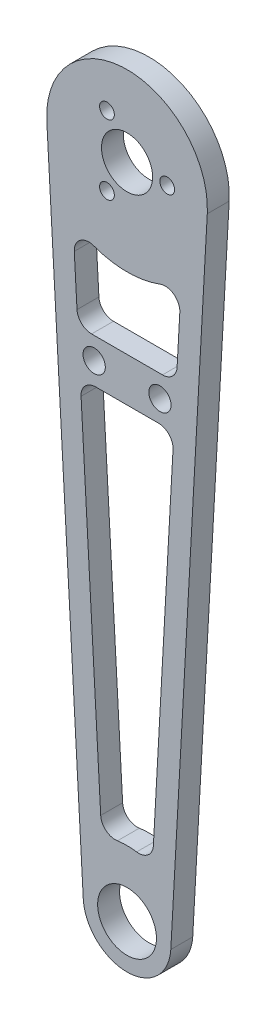
ISO-10303-21;
HEADER;
FILE_DESCRIPTION(('STEP AP214'),'2;1');
FILE_NAME('part.step','',(''),(''),'','','');
FILE_SCHEMA(('AUTOMOTIVE_DESIGN { 1 0 10303 214 1 1 1 1 }'));
ENDSEC;
DATA;
#1=APPLICATION_CONTEXT('core data for automotive mechanical design processes');
#2=APPLICATION_PROTOCOL_DEFINITION('international standard','automotive_design',2000,#1);
#3=PRODUCT_CONTEXT('',#1,'mechanical');
#4=PRODUCT('Part','Part','',(#3));
#5=PRODUCT_RELATED_PRODUCT_CATEGORY('part','',(#4));
#6=PRODUCT_DEFINITION_FORMATION('','',#4);
#7=PRODUCT_DEFINITION_CONTEXT('part definition',#1,'design');
#8=PRODUCT_DEFINITION('design','',#6,#7);
#9=PRODUCT_DEFINITION_SHAPE('','',#8);
#10=(LENGTH_UNIT() NAMED_UNIT(*) SI_UNIT(.MILLI.,.METRE.));
#11=(NAMED_UNIT(*) PLANE_ANGLE_UNIT() SI_UNIT($,.RADIAN.));
#12=(NAMED_UNIT(*) SI_UNIT($,.STERADIAN.) SOLID_ANGLE_UNIT());
#13=UNCERTAINTY_MEASURE_WITH_UNIT(LENGTH_MEASURE(1.E-05),#10,'distance_accuracy_value','');
#14=(GEOMETRIC_REPRESENTATION_CONTEXT(3) GLOBAL_UNCERTAINTY_ASSIGNED_CONTEXT((#13)) GLOBAL_UNIT_ASSIGNED_CONTEXT((#10,
#11,#12)) REPRESENTATION_CONTEXT('',''));
#15=CARTESIAN_POINT('',(0.,0.,0.));
#16=DIRECTION('',(0.,0.,1.));
#17=DIRECTION('',(1.,0.,0.));
#18=AXIS2_PLACEMENT_3D('',#15,#16,#17);
#19=CARTESIAN_POINT('',(7.98764478027175,-0.444444444444444,3.));
#20=DIRECTION('',(0.998455597533968,-0.0555555555555554,0.));
#21=DIRECTION('',(0.0555555555555555,0.998455597533968,0.));
#22=AXIS2_PLACEMENT_3D('',#19,#20,#21);
#23=PLANE('',#22);
#24=DIRECTION('',(-0.0555555555555555,-0.998455597533968,0.));
#25=VECTOR('',#24,1.);
#26=CARTESIAN_POINT('',(7.98764478027175,-0.444444444444444,3.));
#27=LINE('',#26,#25);
#28=CARTESIAN_POINT('',(6.29384167167906,-30.885813952551,3.));
#29=VERTEX_POINT('',#28);
#30=CARTESIAN_POINT('',(3.6039474120521,-79.2291335979336,3.));
#31=VERTEX_POINT('',#30);
#32=EDGE_CURVE('E343',#29,#31,#27,.T.);
#33=ORIENTED_EDGE('',*,*,#32,.F.);
#34=DIRECTION('',(0.,0.,1.));
#35=VECTOR('',#34,1.);
#36=CARTESIAN_POINT('',(6.29384167167906,-30.885813952551,3.));
#37=LINE('',#36,#35);
#38=CARTESIAN_POINT('',(6.29384167167906,-30.885813952551,0.));
#39=VERTEX_POINT('',#38);
#40=EDGE_CURVE('E248',#29,#39,#37,.F.);
#41=ORIENTED_EDGE('',*,*,#40,.T.);
#42=DIRECTION('',(-0.0555555555555555,-0.998455597533968,0.));
#43=VECTOR('',#42,1.);
#44=CARTESIAN_POINT('',(7.98764478027175,-0.444444444444444,0.));
#45=LINE('',#44,#43);
#46=CARTESIAN_POINT('',(3.6039474120521,-79.2291335979336,0.));
#47=VERTEX_POINT('',#46);
#48=EDGE_CURVE('E392',#39,#47,#45,.T.);
#49=ORIENTED_EDGE('',*,*,#48,.T.);
#50=DIRECTION('',(0.,0.,1.));
#51=VECTOR('',#50,1.);
#52=CARTESIAN_POINT('',(3.6039474120521,-79.2291335979336,3.));
#53=LINE('',#52,#51);
#54=EDGE_CURVE('E245',#47,#31,#53,.T.);
#55=ORIENTED_EDGE('',*,*,#54,.T.);
#56=EDGE_LOOP('',(#33,#41,#49,#55));
#57=FACE_BOUND('',#56,.T.);
#58=ADVANCED_FACE('F41',(#57),#23,.F.);
#59=CARTESIAN_POINT('',(-7.98764478027175,-0.444444444444445,3.));
#60=DIRECTION('',(0.998455597533968,0.0555555555555557,0.));
#61=DIRECTION('',(-0.0555555555555557,0.998455597533968,0.));
#62=AXIS2_PLACEMENT_3D('',#59,#60,#61);
#63=PLANE('',#62);
#64=DIRECTION('',(0.0555555555555557,-0.998455597533968,0.));
#65=VECTOR('',#64,1.);
#66=CARTESIAN_POINT('',(-7.98764478027175,-0.444444444444445,0.));
#67=LINE('',#66,#65);
#68=CARTESIAN_POINT('',(-6.29384167167905,-30.885813952551,0.));
#69=VERTEX_POINT('',#68);
#70=CARTESIAN_POINT('',(-3.60394741205208,-79.2291335979336,0.));
#71=VERTEX_POINT('',#70);
#72=EDGE_CURVE('E399',#69,#71,#67,.T.);
#73=ORIENTED_EDGE('',*,*,#72,.F.);
#74=DIRECTION('',(0.,0.,1.));
#75=VECTOR('',#74,1.);
#76=CARTESIAN_POINT('',(-6.29384167167905,-30.885813952551,3.));
#77=LINE('',#76,#75);
#78=CARTESIAN_POINT('',(-6.29384167167905,-30.885813952551,3.));
#79=VERTEX_POINT('',#78);
#80=EDGE_CURVE('E234',#69,#79,#77,.T.);
#81=ORIENTED_EDGE('',*,*,#80,.T.);
#82=DIRECTION('',(0.0555555555555557,-0.998455597533968,0.));
#83=VECTOR('',#82,1.);
#84=CARTESIAN_POINT('',(-7.98764478027175,-0.444444444444445,3.));
#85=LINE('',#84,#83);
#86=CARTESIAN_POINT('',(-3.60394741205208,-79.2291335979336,3.));
#87=VERTEX_POINT('',#86);
#88=EDGE_CURVE('E347',#79,#87,#85,.T.);
#89=ORIENTED_EDGE('',*,*,#88,.T.);
#90=DIRECTION('',(0.,0.,-1.));
#91=VECTOR('',#90,1.);
#92=CARTESIAN_POINT('',(-3.60394741205208,-79.2291335979336,3.));
#93=LINE('',#92,#91);
#94=EDGE_CURVE('E230',#87,#71,#93,.T.);
#95=ORIENTED_EDGE('',*,*,#94,.T.);
#96=EDGE_LOOP('',(#73,#81,#89,#95));
#97=FACE_BOUND('',#96,.T.);
#98=ADVANCED_FACE('F484',(#97),#63,.T.);
#99=CARTESIAN_POINT('',(7.22388216444578,-14.1709395056998,0.));
#100=VERTEX_POINT('',#99);
#101=CARTESIAN_POINT('',(6.85025655575371,-20.885813952551,0.));
#102=VERTEX_POINT('',#101);
#103=EDGE_CURVE('E319',#100,#102,#45,.T.);
#104=ORIENTED_EDGE('',*,*,#103,.T.);
#105=DIRECTION('',(0.,0.,1.));
#106=VECTOR('',#105,1.);
#107=CARTESIAN_POINT('',(6.85025655575371,-20.885813952551,3.));
#108=LINE('',#107,#106);
#109=CARTESIAN_POINT('',(6.85025655575371,-20.885813952551,3.));
#110=VERTEX_POINT('',#109);
#111=EDGE_CURVE('E214',#102,#110,#108,.T.);
#112=ORIENTED_EDGE('',*,*,#111,.T.);
#113=CARTESIAN_POINT('',(7.22388216444578,-14.1709395056998,3.));
#114=VERTEX_POINT('',#113);
#115=EDGE_CURVE('E336',#114,#110,#27,.T.);
#116=ORIENTED_EDGE('',*,*,#115,.F.);
#117=DIRECTION('',(0.,0.,1.));
#118=VECTOR('',#117,1.);
#119=CARTESIAN_POINT('',(7.22388216444578,-14.1709395056998,0.));
#120=LINE('',#119,#118);
#121=EDGE_CURVE('E209',#114,#100,#120,.F.);
#122=ORIENTED_EDGE('',*,*,#121,.T.);
#123=EDGE_LOOP('',(#104,#112,#116,#122));
#124=FACE_BOUND('',#123,.T.);
#125=ADVANCED_FACE('F339',(#124),#23,.F.);
#126=CARTESIAN_POINT('',(0.,-90.,3.));
#127=DIRECTION('',(0.,0.,-1.));
#128=DIRECTION('',(-1.,0.,0.));
#129=AXIS2_PLACEMENT_3D('',#126,#127,#128);
#130=CYLINDRICAL_SURFACE('',#129,9.00000000000001);
#131=CARTESIAN_POINT('',(0.,-90.,0.));
#132=DIRECTION('',(0.,0.,1.));
#133=DIRECTION('',(1.,0.,0.));
#134=AXIS2_PLACEMENT_3D('',#131,#132,#133);
#135=CIRCLE('',#134,9.00000000000001);
#136=CARTESIAN_POINT('',(1.31484781389614,-81.0965638528547,0.));
#137=VERTEX_POINT('',#136);
#138=CARTESIAN_POINT('',(-1.31484781389612,-81.0965638528547,0.));
#139=VERTEX_POINT('',#138);
#140=EDGE_CURVE('E396',#137,#139,#135,.T.);
#141=ORIENTED_EDGE('',*,*,#140,.T.);
#142=DIRECTION('',(0.,0.,-1.));
#143=VECTOR('',#142,1.);
#144=CARTESIAN_POINT('',(-1.31484781389612,-81.0965638528547,3.));
#145=LINE('',#144,#143);
#146=CARTESIAN_POINT('',(-1.31484781389612,-81.0965638528547,3.));
#147=VERTEX_POINT('',#146);
#148=EDGE_CURVE('E57',#139,#147,#145,.F.);
#149=ORIENTED_EDGE('',*,*,#148,.T.);
#150=CARTESIAN_POINT('',(0.,-90.,3.));
#151=DIRECTION('',(0.,0.,1.));
#152=DIRECTION('',(1.,0.,0.));
#153=AXIS2_PLACEMENT_3D('',#150,#151,#152);
#154=CIRCLE('',#153,9.00000000000001);
#155=CARTESIAN_POINT('',(1.31484781389614,-81.0965638528547,3.));
#156=VERTEX_POINT('',#155);
#157=EDGE_CURVE('E342',#156,#147,#154,.T.);
#158=ORIENTED_EDGE('',*,*,#157,.F.);
#159=DIRECTION('',(0.,0.,-1.));
#160=VECTOR('',#159,1.);
#161=CARTESIAN_POINT('',(1.31484781389614,-81.0965638528547,3.));
#162=LINE('',#161,#160);
#163=EDGE_CURVE('E264',#156,#137,#162,.T.);
#164=ORIENTED_EDGE('',*,*,#163,.T.);
#165=EDGE_LOOP('',(#141,#149,#158,#164));
#166=FACE_BOUND('',#165,.T.);
#167=ADVANCED_FACE('F497',(#166),#130,.T.);
#168=CARTESIAN_POINT('',(-7.22388216444577,-14.1709395056998,3.));
#169=VERTEX_POINT('',#168);
#170=CARTESIAN_POINT('',(-6.85025655575371,-20.885813952551,3.));
#171=VERTEX_POINT('',#170);
#172=EDGE_CURVE('E352',#169,#171,#85,.T.);
#173=ORIENTED_EDGE('',*,*,#172,.T.);
#174=DIRECTION('',(0.,0.,1.));
#175=VECTOR('',#174,1.);
#176=CARTESIAN_POINT('',(-6.85025655575371,-20.885813952551,0.));
#177=LINE('',#176,#175);
#178=CARTESIAN_POINT('',(-6.85025655575371,-20.885813952551,0.));
#179=VERTEX_POINT('',#178);
#180=EDGE_CURVE('E254',#171,#179,#177,.F.);
#181=ORIENTED_EDGE('',*,*,#180,.T.);
#182=CARTESIAN_POINT('',(-7.22388216444577,-14.1709395056998,0.));
#183=VERTEX_POINT('',#182);
#184=EDGE_CURVE('E330',#183,#179,#67,.T.);
#185=ORIENTED_EDGE('',*,*,#184,.F.);
#186=DIRECTION('',(0.,0.,-1.));
#187=VECTOR('',#186,1.);
#188=CARTESIAN_POINT('',(-7.22388216444577,-14.1709395056998,3.));
#189=LINE('',#188,#187);
#190=EDGE_CURVE('E251',#183,#169,#189,.F.);
#191=ORIENTED_EDGE('',*,*,#190,.T.);
#192=EDGE_LOOP('',(#173,#181,#185,#191));
#193=FACE_BOUND('',#192,.T.);
#194=ADVANCED_FACE('F492',(#193),#63,.T.);
#195=CARTESIAN_POINT('',(-10.9830115728737,-0.611111111111113,3.));
#196=DIRECTION('',(0.998455597533968,0.0555555555555557,0.));
#197=DIRECTION('',(-0.0555555555555557,0.998455597533968,0.));
#198=AXIS2_PLACEMENT_3D('',#195,#196,#197);
#199=PLANE('',#198);
#200=DIRECTION('',(0.0555555555555557,-0.998455597533968,0.));
#201=VECTOR('',#200,1.);
#202=CARTESIAN_POINT('',(-10.9830115728737,-0.611111111111113,0.));
#203=LINE('',#202,#201);
#204=CARTESIAN_POINT('',(-10.9830115728737,-0.611111111111112,0.));
#205=VERTEX_POINT('',#204);
#206=CARTESIAN_POINT('',(-5.9907335852038,-90.3333333333333,0.));
#207=VERTEX_POINT('',#206);
#208=EDGE_CURVE('E207',#205,#207,#203,.T.);
#209=ORIENTED_EDGE('',*,*,#208,.T.);
#210=DIRECTION('',(0.,0.,-1.));
#211=VECTOR('',#210,1.);
#212=CARTESIAN_POINT('',(-5.9907335852038,-90.3333333333333,3.));
#213=LINE('',#212,#211);
#214=CARTESIAN_POINT('',(-5.9907335852038,-90.3333333333333,3.));
#215=VERTEX_POINT('',#214);
#216=EDGE_CURVE('E185',#215,#207,#213,.T.);
#217=ORIENTED_EDGE('',*,*,#216,.F.);
#218=DIRECTION('',(0.0555555555555557,-0.998455597533968,0.));
#219=VECTOR('',#218,1.);
#220=CARTESIAN_POINT('',(-10.9830115728737,-0.611111111111113,3.));
#221=LINE('',#220,#219);
#222=CARTESIAN_POINT('',(-10.9830115728737,-0.611111111111112,3.));
#223=VERTEX_POINT('',#222);
#224=EDGE_CURVE('E193',#223,#215,#221,.T.);
#225=ORIENTED_EDGE('',*,*,#224,.F.);
#226=DIRECTION('',(0.,0.,-1.));
#227=VECTOR('',#226,1.);
#228=CARTESIAN_POINT('',(-10.9830115728737,-0.611111111111112,3.));
#229=LINE('',#228,#227);
#230=EDGE_CURVE('E378',#223,#205,#229,.T.);
#231=ORIENTED_EDGE('',*,*,#230,.T.);
#232=EDGE_LOOP('',(#209,#217,#225,#231));
#233=FACE_BOUND('',#232,.T.);
#234=ADVANCED_FACE('F205',(#233),#199,.F.);
#235=CARTESIAN_POINT('',(0.,-90.,3.));
#236=DIRECTION('',(0.,0.,-1.));
#237=DIRECTION('',(-1.,0.,0.));
#238=AXIS2_PLACEMENT_3D('',#235,#236,#237);
#239=CYLINDRICAL_SURFACE('',#238,6.);
#240=CARTESIAN_POINT('',(0.,-90.,0.));
#241=DIRECTION('',(0.,0.,1.));
#242=DIRECTION('',(1.,0.,0.));
#243=AXIS2_PLACEMENT_3D('',#240,#241,#242);
#244=CIRCLE('',#243,6.);
#245=CARTESIAN_POINT('',(5.99073358520382,-90.3333333333333,0.));
#246=VERTEX_POINT('',#245);
#247=EDGE_CURVE('E381',#207,#246,#244,.T.);
#248=ORIENTED_EDGE('',*,*,#247,.T.);
#249=DIRECTION('',(0.,0.,-1.));
#250=VECTOR('',#249,1.);
#251=CARTESIAN_POINT('',(5.99073358520382,-90.3333333333333,3.));
#252=LINE('',#251,#250);
#253=CARTESIAN_POINT('',(5.99073358520382,-90.3333333333333,3.));
#254=VERTEX_POINT('',#253);
#255=EDGE_CURVE('E187',#254,#246,#252,.T.);
#256=ORIENTED_EDGE('',*,*,#255,.F.);
#257=CARTESIAN_POINT('',(0.,-90.,3.));
#258=DIRECTION('',(0.,0.,1.));
#259=DIRECTION('',(1.,0.,0.));
#260=AXIS2_PLACEMENT_3D('',#257,#258,#259);
#261=CIRCLE('',#260,6.);
#262=EDGE_CURVE('E180',#215,#254,#261,.T.);
#263=ORIENTED_EDGE('',*,*,#262,.F.);
#264=ORIENTED_EDGE('',*,*,#216,.T.);
#265=EDGE_LOOP('',(#248,#256,#263,#264));
#266=FACE_BOUND('',#265,.T.);
#267=ADVANCED_FACE('F183',(#266),#239,.T.);
#268=CARTESIAN_POINT('',(10.9830115728737,-0.61111111111111,3.));
#269=DIRECTION('',(0.998455597533968,-0.0555555555555555,0.));
#270=DIRECTION('',(0.0555555555555555,0.998455597533968,0.));
#271=AXIS2_PLACEMENT_3D('',#268,#269,#270);
#272=PLANE('',#271);
#273=DIRECTION('',(-0.0555555555555555,-0.998455597533968,0.));
#274=VECTOR('',#273,1.);
#275=CARTESIAN_POINT('',(10.9830115728737,-0.61111111111111,0.));
#276=LINE('',#275,#274);
#277=CARTESIAN_POINT('',(10.9830115728737,-0.61111111111111,0.));
#278=VERTEX_POINT('',#277);
#279=EDGE_CURVE('E385',#278,#246,#276,.T.);
#280=ORIENTED_EDGE('',*,*,#279,.F.);
#281=DIRECTION('',(0.,0.,-1.));
#282=VECTOR('',#281,1.);
#283=CARTESIAN_POINT('',(10.9830115728737,-0.61111111111111,3.));
#284=LINE('',#283,#282);
#285=CARTESIAN_POINT('',(10.9830115728737,-0.61111111111111,3.));
#286=VERTEX_POINT('',#285);
#287=EDGE_CURVE('E216',#286,#278,#284,.T.);
#288=ORIENTED_EDGE('',*,*,#287,.F.);
#289=DIRECTION('',(-0.0555555555555555,-0.998455597533968,0.));
#290=VECTOR('',#289,1.);
#291=CARTESIAN_POINT('',(10.9830115728737,-0.61111111111111,3.));
#292=LINE('',#291,#290);
#293=EDGE_CURVE('E192',#286,#254,#292,.T.);
#294=ORIENTED_EDGE('',*,*,#293,.T.);
#295=ORIENTED_EDGE('',*,*,#255,.T.);
#296=EDGE_LOOP('',(#280,#288,#294,#295));
#297=FACE_BOUND('',#296,.T.);
#298=ADVANCED_FACE('F429',(#297),#272,.T.);
#299=CARTESIAN_POINT('',(5.5,0.,3.));
#300=DIRECTION('',(0.,0.,-1.));
#301=DIRECTION('',(-1.,0.,0.));
#302=AXIS2_PLACEMENT_3D('',#299,#300,#301);
#303=CYLINDRICAL_SURFACE('',#302,1.01);
#304=CARTESIAN_POINT('',(5.5,0.,3.));
#305=DIRECTION('',(0.,0.,1.));
#306=DIRECTION('',(1.,0.,0.));
#307=AXIS2_PLACEMENT_3D('',#304,#305,#306);
#308=CIRCLE('',#307,1.01);
#309=CARTESIAN_POINT('',(6.51,0.,3.));
#310=VERTEX_POINT('',#309);
#311=EDGE_CURVE('E370',#310,#310,#308,.T.);
#312=ORIENTED_EDGE('',*,*,#311,.T.);
#313=EDGE_LOOP('',(#312));
#314=FACE_BOUND('',#313,.T.);
#315=CARTESIAN_POINT('',(5.5,0.,0.));
#316=DIRECTION('',(0.,0.,1.));
#317=DIRECTION('',(1.,0.,0.));
#318=AXIS2_PLACEMENT_3D('',#315,#316,#317);
#319=CIRCLE('',#318,1.01);
#320=CARTESIAN_POINT('',(6.51,0.,0.));
#321=VERTEX_POINT('',#320);
#322=EDGE_CURVE('E414',#321,#321,#319,.T.);
#323=ORIENTED_EDGE('',*,*,#322,.F.);
#324=EDGE_LOOP('',(#323));
#325=FACE_BOUND('',#324,.T.);
#326=ADVANCED_FACE('F519',(#314,#325),#303,.F.);
#327=CARTESIAN_POINT('',(-2.75,-4.76313972081441,3.));
#328=DIRECTION('',(0.,0.,-1.));
#329=DIRECTION('',(-1.,0.,0.));
#330=AXIS2_PLACEMENT_3D('',#327,#328,#329);
#331=CYLINDRICAL_SURFACE('',#330,1.01);
#332=CARTESIAN_POINT('',(-2.75,-4.76313972081441,3.));
#333=DIRECTION('',(0.,0.,1.));
#334=DIRECTION('',(1.,0.,0.));
#335=AXIS2_PLACEMENT_3D('',#332,#333,#334);
#336=CIRCLE('',#335,1.01);
#337=CARTESIAN_POINT('',(-1.74,-4.76313972081441,3.));
#338=VERTEX_POINT('',#337);
#339=EDGE_CURVE('E366',#338,#338,#336,.T.);
#340=ORIENTED_EDGE('',*,*,#339,.T.);
#341=EDGE_LOOP('',(#340));
#342=FACE_BOUND('',#341,.T.);
#343=CARTESIAN_POINT('',(-2.75,-4.76313972081441,0.));
#344=DIRECTION('',(0.,0.,1.));
#345=DIRECTION('',(1.,0.,0.));
#346=AXIS2_PLACEMENT_3D('',#343,#344,#345);
#347=CIRCLE('',#346,1.01);
#348=CARTESIAN_POINT('',(-1.74,-4.76313972081441,0.));
#349=VERTEX_POINT('',#348);
#350=EDGE_CURVE('E410',#349,#349,#347,.T.);
#351=ORIENTED_EDGE('',*,*,#350,.F.);
#352=EDGE_LOOP('',(#351));
#353=FACE_BOUND('',#352,.T.);
#354=ADVANCED_FACE('F515',(#342,#353),#331,.F.);
#355=CARTESIAN_POINT('',(-2.75,4.76313972081441,3.));
#356=DIRECTION('',(0.,0.,-1.));
#357=DIRECTION('',(-1.,0.,0.));
#358=AXIS2_PLACEMENT_3D('',#355,#356,#357);
#359=CYLINDRICAL_SURFACE('',#358,1.01);
#360=CARTESIAN_POINT('',(-2.75,4.76313972081441,3.));
#361=DIRECTION('',(0.,0.,1.));
#362=DIRECTION('',(1.,0.,0.));
#363=AXIS2_PLACEMENT_3D('',#360,#361,#362);
#364=CIRCLE('',#363,1.01);
#365=CARTESIAN_POINT('',(-1.74,4.76313972081441,3.));
#366=VERTEX_POINT('',#365);
#367=EDGE_CURVE('E362',#366,#366,#364,.T.);
#368=ORIENTED_EDGE('',*,*,#367,.T.);
#369=EDGE_LOOP('',(#368));
#370=FACE_BOUND('',#369,.T.);
#371=CARTESIAN_POINT('',(-2.75,4.76313972081441,0.));
#372=DIRECTION('',(0.,0.,1.));
#373=DIRECTION('',(1.,0.,0.));
#374=AXIS2_PLACEMENT_3D('',#371,#372,#373);
#375=CIRCLE('',#374,1.01);
#376=CARTESIAN_POINT('',(-1.74,4.76313972081441,0.));
#377=VERTEX_POINT('',#376);
#378=EDGE_CURVE('E406',#377,#377,#375,.T.);
#379=ORIENTED_EDGE('',*,*,#378,.F.);
#380=EDGE_LOOP('',(#379));
#381=FACE_BOUND('',#380,.T.);
#382=ADVANCED_FACE('F511',(#370,#381),#359,.F.);
#383=CARTESIAN_POINT('',(0.,0.,3.));
#384=DIRECTION('',(0.,0.,-1.));
#385=DIRECTION('',(-1.,0.,0.));
#386=AXIS2_PLACEMENT_3D('',#383,#384,#385);
#387=CYLINDRICAL_SURFACE('',#386,3.5);
#388=CARTESIAN_POINT('',(0.,0.,3.));
#389=DIRECTION('',(0.,0.,1.));
#390=DIRECTION('',(1.,0.,0.));
#391=AXIS2_PLACEMENT_3D('',#388,#389,#390);
#392=CIRCLE('',#391,3.5);
#393=CARTESIAN_POINT('',(3.5,0.,3.));
#394=VERTEX_POINT('',#393);
#395=EDGE_CURVE('E358',#394,#394,#392,.T.);
#396=ORIENTED_EDGE('',*,*,#395,.T.);
#397=EDGE_LOOP('',(#396));
#398=FACE_BOUND('',#397,.T.);
#399=CARTESIAN_POINT('',(0.,0.,0.));
#400=DIRECTION('',(0.,0.,1.));
#401=DIRECTION('',(1.,0.,0.));
#402=AXIS2_PLACEMENT_3D('',#399,#400,#401);
#403=CIRCLE('',#402,3.5);
#404=CARTESIAN_POINT('',(3.5,0.,0.));
#405=VERTEX_POINT('',#404);
#406=EDGE_CURVE('E329',#405,#405,#403,.T.);
#407=ORIENTED_EDGE('',*,*,#406,.F.);
#408=EDGE_LOOP('',(#407));
#409=FACE_BOUND('',#408,.T.);
#410=ADVANCED_FACE('F508',(#398,#409),#387,.F.);
#411=CARTESIAN_POINT('',(0.,0.,3.));
#412=DIRECTION('',(0.,0.,-1.));
#413=DIRECTION('',(-1.,0.,0.));
#414=AXIS2_PLACEMENT_3D('',#411,#412,#413);
#415=CYLINDRICAL_SURFACE('',#414,13.);
#416=CARTESIAN_POINT('',(0.,0.,3.));
#417=DIRECTION('',(0.,0.,1.));
#418=DIRECTION('',(1.,0.,0.));
#419=AXIS2_PLACEMENT_3D('',#416,#417,#418);
#420=CIRCLE('',#419,13.);
#421=CARTESIAN_POINT('',(-4.53004150679412,-12.1851846086435,3.));
#422=VERTEX_POINT('',#421);
#423=CARTESIAN_POINT('',(4.53004150679413,-12.1851846086435,3.));
#424=VERTEX_POINT('',#423);
#425=EDGE_CURVE('E337',#422,#424,#420,.T.);
#426=ORIENTED_EDGE('',*,*,#425,.F.);
#427=DIRECTION('',(0.,0.,-1.));
#428=VECTOR('',#427,1.);
#429=CARTESIAN_POINT('',(-4.53004150679412,-12.1851846086435,3.));
#430=LINE('',#429,#428);
#431=CARTESIAN_POINT('',(-4.53004150679412,-12.1851846086435,0.));
#432=VERTEX_POINT('',#431);
#433=EDGE_CURVE('E260',#422,#432,#430,.T.);
#434=ORIENTED_EDGE('',*,*,#433,.T.);
#435=CARTESIAN_POINT('',(0.,0.,0.));
#436=DIRECTION('',(0.,0.,1.));
#437=DIRECTION('',(1.,0.,0.));
#438=AXIS2_PLACEMENT_3D('',#435,#436,#437);
#439=CIRCLE('',#438,13.);
#440=CARTESIAN_POINT('',(4.53004150679413,-12.1851846086435,0.));
#441=VERTEX_POINT('',#440);
#442=EDGE_CURVE('E317',#432,#441,#439,.T.);
#443=ORIENTED_EDGE('',*,*,#442,.T.);
#444=DIRECTION('',(0.,0.,-1.));
#445=VECTOR('',#444,1.);
#446=CARTESIAN_POINT('',(4.53004150679413,-12.1851846086435,3.));
#447=LINE('',#446,#445);
#448=EDGE_CURVE('E257',#441,#424,#447,.F.);
#449=ORIENTED_EDGE('',*,*,#448,.T.);
#450=EDGE_LOOP('',(#426,#434,#443,#449));
#451=FACE_BOUND('',#450,.T.);
#452=ADVANCED_FACE('F325',(#451),#415,.T.);
#453=CARTESIAN_POINT('',(0.,0.,3.));
#454=DIRECTION('',(0.,0.,-1.));
#455=DIRECTION('',(-1.,0.,0.));
#456=AXIS2_PLACEMENT_3D('',#453,#454,#455);
#457=CYLINDRICAL_SURFACE('',#456,11.);
#458=CARTESIAN_POINT('',(0.,0.,0.));
#459=DIRECTION('',(0.,0.,1.));
#460=DIRECTION('',(1.,0.,0.));
#461=AXIS2_PLACEMENT_3D('',#458,#459,#460);
#462=CIRCLE('',#461,11.);
#463=EDGE_CURVE('E389',#278,#205,#462,.T.);
#464=ORIENTED_EDGE('',*,*,#463,.T.);
#465=ORIENTED_EDGE('',*,*,#230,.F.);
#466=CARTESIAN_POINT('',(0.,0.,3.));
#467=DIRECTION('',(0.,0.,1.));
#468=DIRECTION('',(1.,0.,0.));
#469=AXIS2_PLACEMENT_3D('',#466,#467,#468);
#470=CIRCLE('',#469,11.);
#471=EDGE_CURVE('E198',#286,#223,#470,.T.);
#472=ORIENTED_EDGE('',*,*,#471,.F.);
#473=ORIENTED_EDGE('',*,*,#287,.T.);
#474=EDGE_LOOP('',(#464,#465,#472,#473));
#475=FACE_BOUND('',#474,.T.);
#476=ADVANCED_FACE('F425',(#475),#457,.T.);
#477=CARTESIAN_POINT('',(0.,-90.,3.));
#478=DIRECTION('',(0.,0.,-1.));
#479=DIRECTION('',(-1.,0.,0.));
#480=AXIS2_PLACEMENT_3D('',#477,#478,#479);
#481=CYLINDRICAL_SURFACE('',#480,4.025);
#482=CARTESIAN_POINT('',(0.,-90.,3.));
#483=DIRECTION('',(0.,0.,1.));
#484=DIRECTION('',(1.,0.,0.));
#485=AXIS2_PLACEMENT_3D('',#482,#483,#484);
#486=CIRCLE('',#485,4.025);
#487=CARTESIAN_POINT('',(4.02500000000001,-90.,3.));
#488=VERTEX_POINT('',#487);
#489=EDGE_CURVE('E374',#488,#488,#486,.T.);
#490=ORIENTED_EDGE('',*,*,#489,.T.);
#491=EDGE_LOOP('',(#490));
#492=FACE_BOUND('',#491,.T.);
#493=CARTESIAN_POINT('',(0.,-90.,0.));
#494=DIRECTION('',(0.,0.,1.));
#495=DIRECTION('',(1.,0.,0.));
#496=AXIS2_PLACEMENT_3D('',#493,#494,#495);
#497=CIRCLE('',#496,4.025);
#498=CARTESIAN_POINT('',(4.02500000000001,-90.,0.));
#499=VERTEX_POINT('',#498);
#500=EDGE_CURVE('E203',#499,#499,#497,.T.);
#501=ORIENTED_EDGE('',*,*,#500,.F.);
#502=EDGE_LOOP('',(#501));
#503=FACE_BOUND('',#502,.T.);
#504=ADVANCED_FACE('F479',(#492,#503),#481,.F.);
#505=CARTESIAN_POINT('',(0.,0.,3.));
#506=DIRECTION('',(0.,0.,1.));
#507=DIRECTION('',(1.,0.,0.));
#508=AXIS2_PLACEMENT_3D('',#505,#506,#507);
#509=PLANE('',#508);
#510=ORIENTED_EDGE('',*,*,#425,.T.);
#511=CARTESIAN_POINT('',(5.22697096937784,-14.0598283945887,3.));
#512=DIRECTION('',(0.,0.,1.));
#513=DIRECTION('',(1.,0.,0.));
#514=AXIS2_PLACEMENT_3D('',#511,#512,#513);
#515=CIRCLE('',#514,2.);
#516=EDGE_CURVE('E11',#424,#114,#515,.F.);
#517=ORIENTED_EDGE('',*,*,#516,.T.);
#518=ORIENTED_EDGE('',*,*,#115,.T.);
#519=CARTESIAN_POINT('',(4.85334536068578,-20.7747028414399,3.));
#520=DIRECTION('',(0.,0.,1.));
#521=DIRECTION('',(1.,0.,0.));
#522=AXIS2_PLACEMENT_3D('',#519,#520,#521);
#523=CIRCLE('',#522,2.);
#524=CARTESIAN_POINT('',(4.85334536068578,-22.7747028414399,3.));
#525=VERTEX_POINT('',#524);
#526=EDGE_CURVE('E270',#110,#525,#523,.F.);
#527=ORIENTED_EDGE('',*,*,#526,.T.);
#528=DIRECTION('',(-1.,0.,0.));
#529=VECTOR('',#528,1.);
#530=CARTESIAN_POINT('',(-6.7451559665396,-22.7747028414399,3.));
#531=LINE('',#530,#529);
#532=CARTESIAN_POINT('',(-4.85334536068577,-22.7747028414399,3.));
#533=VERTEX_POINT('',#532);
#534=EDGE_CURVE('E438',#525,#533,#531,.T.);
#535=ORIENTED_EDGE('',*,*,#534,.T.);
#536=CARTESIAN_POINT('',(-4.85334536068577,-20.7747028414399,3.));
#537=DIRECTION('',(0.,0.,1.));
#538=DIRECTION('',(1.,0.,0.));
#539=AXIS2_PLACEMENT_3D('',#536,#537,#538);
#540=CIRCLE('',#539,2.);
#541=EDGE_CURVE('E288',#533,#171,#540,.F.);
#542=ORIENTED_EDGE('',*,*,#541,.T.);
#543=ORIENTED_EDGE('',*,*,#172,.F.);
#544=CARTESIAN_POINT('',(-5.22697096937783,-14.0598283945887,3.));
#545=DIRECTION('',(0.,0.,1.));
#546=DIRECTION('',(1.,0.,0.));
#547=AXIS2_PLACEMENT_3D('',#544,#545,#546);
#548=CIRCLE('',#547,2.);
#549=EDGE_CURVE('E297',#169,#422,#548,.F.);
#550=ORIENTED_EDGE('',*,*,#549,.T.);
#551=EDGE_LOOP('',(#510,#517,#518,#527,#535,#542,#543,#550));
#552=FACE_BOUND('',#551,.T.);
#553=ORIENTED_EDGE('',*,*,#224,.T.);
#554=ORIENTED_EDGE('',*,*,#262,.T.);
#555=ORIENTED_EDGE('',*,*,#293,.F.);
#556=ORIENTED_EDGE('',*,*,#471,.T.);
#557=EDGE_LOOP('',(#553,#554,#555,#556));
#558=FACE_BOUND('',#557,.T.);
#559=ORIENTED_EDGE('',*,*,#88,.F.);
#560=CARTESIAN_POINT('',(-4.29693047661111,-30.7747028414399,3.));
#561=DIRECTION('',(0.,0.,1.));
#562=DIRECTION('',(1.,0.,0.));
#563=AXIS2_PLACEMENT_3D('',#560,#561,#562);
#564=CIRCLE('',#563,2.);
#565=CARTESIAN_POINT('',(-4.29693047661111,-28.7747028414399,3.));
#566=VERTEX_POINT('',#565);
#567=EDGE_CURVE('E276',#79,#566,#564,.F.);
#568=ORIENTED_EDGE('',*,*,#567,.T.);
#569=DIRECTION('',(1.,0.,0.));
#570=VECTOR('',#569,1.);
#571=CARTESIAN_POINT('',(-6.41130703609481,-28.7747028414399,3.));
#572=LINE('',#571,#570);
#573=CARTESIAN_POINT('',(4.29693047661112,-28.7747028414399,3.));
#574=VERTEX_POINT('',#573);
#575=EDGE_CURVE('E443',#566,#574,#572,.T.);
#576=ORIENTED_EDGE('',*,*,#575,.T.);
#577=CARTESIAN_POINT('',(4.29693047661112,-30.7747028414399,3.));
#578=DIRECTION('',(0.,0.,1.));
#579=DIRECTION('',(1.,0.,0.));
#580=AXIS2_PLACEMENT_3D('',#577,#578,#579);
#581=CIRCLE('',#580,2.);
#582=EDGE_CURVE('E282',#574,#29,#581,.F.);
#583=ORIENTED_EDGE('',*,*,#582,.T.);
#584=ORIENTED_EDGE('',*,*,#32,.T.);
#585=CARTESIAN_POINT('',(1.60703621698416,-79.1180224868225,3.));
#586=DIRECTION('',(0.,0.,1.));
#587=DIRECTION('',(1.,0.,0.));
#588=AXIS2_PLACEMENT_3D('',#585,#586,#587);
#589=CIRCLE('',#588,2.);
#590=EDGE_CURVE('E64',#31,#156,#589,.F.);
#591=ORIENTED_EDGE('',*,*,#590,.T.);
#592=ORIENTED_EDGE('',*,*,#157,.T.);
#593=CARTESIAN_POINT('',(-1.60703621698414,-79.1180224868225,3.));
#594=DIRECTION('',(0.,0.,1.));
#595=DIRECTION('',(1.,0.,0.));
#596=AXIS2_PLACEMENT_3D('',#593,#594,#595);
#597=CIRCLE('',#596,2.);
#598=EDGE_CURVE('E303',#147,#87,#597,.F.);
#599=ORIENTED_EDGE('',*,*,#598,.T.);
#600=EDGE_LOOP('',(#559,#568,#576,#583,#584,#591,#592,#599));
#601=FACE_BOUND('',#600,.T.);
#602=ORIENTED_EDGE('',*,*,#395,.F.);
#603=EDGE_LOOP('',(#602));
#604=FACE_BOUND('',#603,.T.);
#605=ORIENTED_EDGE('',*,*,#367,.F.);
#606=EDGE_LOOP('',(#605));
#607=FACE_BOUND('',#606,.T.);
#608=ORIENTED_EDGE('',*,*,#339,.F.);
#609=EDGE_LOOP('',(#608));
#610=FACE_BOUND('',#609,.T.);
#611=ORIENTED_EDGE('',*,*,#311,.F.);
#612=EDGE_LOOP('',(#611));
#613=FACE_BOUND('',#612,.T.);
#614=ORIENTED_EDGE('',*,*,#489,.F.);
#615=EDGE_LOOP('',(#614));
#616=FACE_BOUND('',#615,.T.);
#617=CARTESIAN_POINT('',(4.5,-25.7747028414399,3.));
#618=DIRECTION('',(0.,0.,1.));
#619=DIRECTION('',(-1.,0.,0.));
#620=AXIS2_PLACEMENT_3D('',#617,#618,#619);
#621=CIRCLE('',#620,1.525);
#622=CARTESIAN_POINT('',(2.97500000000001,-25.7747028414399,3.));
#623=VERTEX_POINT('',#622);
#624=EDGE_CURVE('E451',#623,#623,#621,.T.);
#625=ORIENTED_EDGE('',*,*,#624,.F.);
#626=EDGE_LOOP('',(#625));
#627=FACE_BOUND('',#626,.T.);
#628=CARTESIAN_POINT('',(-4.5,-25.7747028414399,3.));
#629=DIRECTION('',(0.,0.,1.));
#630=DIRECTION('',(1.,0.,0.));
#631=AXIS2_PLACEMENT_3D('',#628,#629,#630);
#632=CIRCLE('',#631,1.525);
#633=CARTESIAN_POINT('',(-2.975,-25.7747028414399,3.));
#634=VERTEX_POINT('',#633);
#635=EDGE_CURVE('E447',#634,#634,#632,.T.);
#636=ORIENTED_EDGE('',*,*,#635,.F.);
#637=EDGE_LOOP('',(#636));
#638=FACE_BOUND('',#637,.T.);
#639=ADVANCED_FACE('F196',(#552,#558,#601,#604,#607,#610,#613,#616,#627,#638),#509,.T.);
#640=CARTESIAN_POINT('',(0.,0.,0.));
#641=DIRECTION('',(0.,0.,1.));
#642=DIRECTION('',(1.,0.,0.));
#643=AXIS2_PLACEMENT_3D('',#640,#641,#642);
#644=PLANE('',#643);
#645=ORIENTED_EDGE('',*,*,#48,.F.);
#646=CARTESIAN_POINT('',(4.29693047661112,-30.7747028414399,0.));
#647=DIRECTION('',(0.,0.,1.));
#648=DIRECTION('',(1.,0.,0.));
#649=AXIS2_PLACEMENT_3D('',#646,#647,#648);
#650=CIRCLE('',#649,2.);
#651=CARTESIAN_POINT('',(4.29693047661112,-28.7747028414399,0.));
#652=VERTEX_POINT('',#651);
#653=EDGE_CURVE('E285',#39,#652,#650,.T.);
#654=ORIENTED_EDGE('',*,*,#653,.T.);
#655=DIRECTION('',(-1.,0.,0.));
#656=VECTOR('',#655,1.);
#657=CARTESIAN_POINT('',(-6.41130703609481,-28.7747028414399,0.));
#658=LINE('',#657,#656);
#659=CARTESIAN_POINT('',(-4.29693047661111,-28.7747028414399,0.));
#660=VERTEX_POINT('',#659);
#661=EDGE_CURVE('E437',#652,#660,#658,.T.);
#662=ORIENTED_EDGE('',*,*,#661,.T.);
#663=CARTESIAN_POINT('',(-4.29693047661111,-30.7747028414399,0.));
#664=DIRECTION('',(0.,0.,1.));
#665=DIRECTION('',(1.,0.,0.));
#666=AXIS2_PLACEMENT_3D('',#663,#664,#665);
#667=CIRCLE('',#666,2.);
#668=EDGE_CURVE('E279',#660,#69,#667,.T.);
#669=ORIENTED_EDGE('',*,*,#668,.T.);
#670=ORIENTED_EDGE('',*,*,#72,.T.);
#671=CARTESIAN_POINT('',(-1.60703621698414,-79.1180224868225,0.));
#672=DIRECTION('',(0.,0.,1.));
#673=DIRECTION('',(1.,0.,0.));
#674=AXIS2_PLACEMENT_3D('',#671,#672,#673);
#675=CIRCLE('',#674,2.);
#676=EDGE_CURVE('E300',#71,#139,#675,.T.);
#677=ORIENTED_EDGE('',*,*,#676,.T.);
#678=ORIENTED_EDGE('',*,*,#140,.F.);
#679=CARTESIAN_POINT('',(1.60703621698416,-79.1180224868225,0.));
#680=DIRECTION('',(0.,0.,1.));
#681=DIRECTION('',(1.,0.,0.));
#682=AXIS2_PLACEMENT_3D('',#679,#680,#681);
#683=CIRCLE('',#682,2.);
#684=EDGE_CURVE('E306',#137,#47,#683,.T.);
#685=ORIENTED_EDGE('',*,*,#684,.T.);
#686=EDGE_LOOP('',(#645,#654,#662,#669,#670,#677,#678,#685));
#687=FACE_BOUND('',#686,.T.);
#688=ORIENTED_EDGE('',*,*,#208,.F.);
#689=ORIENTED_EDGE('',*,*,#463,.F.);
#690=ORIENTED_EDGE('',*,*,#279,.T.);
#691=ORIENTED_EDGE('',*,*,#247,.F.);
#692=EDGE_LOOP('',(#688,#689,#690,#691));
#693=FACE_BOUND('',#692,.T.);
#694=ORIENTED_EDGE('',*,*,#103,.F.);
#695=CARTESIAN_POINT('',(5.22697096937784,-14.0598283945887,0.));
#696=DIRECTION('',(0.,0.,1.));
#697=DIRECTION('',(1.,0.,0.));
#698=AXIS2_PLACEMENT_3D('',#695,#696,#697);
#699=CIRCLE('',#698,2.);
#700=EDGE_CURVE('E50',#100,#441,#699,.T.);
#701=ORIENTED_EDGE('',*,*,#700,.T.);
#702=ORIENTED_EDGE('',*,*,#442,.F.);
#703=CARTESIAN_POINT('',(-5.22697096937783,-14.0598283945887,0.));
#704=DIRECTION('',(0.,0.,1.));
#705=DIRECTION('',(1.,0.,0.));
#706=AXIS2_PLACEMENT_3D('',#703,#704,#705);
#707=CIRCLE('',#706,2.);
#708=EDGE_CURVE('E294',#432,#183,#707,.T.);
#709=ORIENTED_EDGE('',*,*,#708,.T.);
#710=ORIENTED_EDGE('',*,*,#184,.T.);
#711=CARTESIAN_POINT('',(-4.85334536068577,-20.7747028414399,0.));
#712=DIRECTION('',(0.,0.,1.));
#713=DIRECTION('',(1.,0.,0.));
#714=AXIS2_PLACEMENT_3D('',#711,#712,#713);
#715=CIRCLE('',#714,2.);
#716=CARTESIAN_POINT('',(-4.85334536068577,-22.7747028414399,0.));
#717=VERTEX_POINT('',#716);
#718=EDGE_CURVE('E291',#179,#717,#715,.T.);
#719=ORIENTED_EDGE('',*,*,#718,.T.);
#720=DIRECTION('',(1.,0.,0.));
#721=VECTOR('',#720,1.);
#722=CARTESIAN_POINT('',(-6.7451559665396,-22.7747028414399,0.));
#723=LINE('',#722,#721);
#724=CARTESIAN_POINT('',(4.85334536068578,-22.7747028414399,0.));
#725=VERTEX_POINT('',#724);
#726=EDGE_CURVE('E442',#717,#725,#723,.T.);
#727=ORIENTED_EDGE('',*,*,#726,.T.);
#728=CARTESIAN_POINT('',(4.85334536068578,-20.7747028414399,0.));
#729=DIRECTION('',(0.,0.,1.));
#730=DIRECTION('',(1.,0.,0.));
#731=AXIS2_PLACEMENT_3D('',#728,#729,#730);
#732=CIRCLE('',#731,2.);
#733=EDGE_CURVE('E273',#725,#102,#732,.T.);
#734=ORIENTED_EDGE('',*,*,#733,.T.);
#735=EDGE_LOOP('',(#694,#701,#702,#709,#710,#719,#727,#734));
#736=FACE_BOUND('',#735,.T.);
#737=ORIENTED_EDGE('',*,*,#406,.T.);
#738=EDGE_LOOP('',(#737));
#739=FACE_BOUND('',#738,.T.);
#740=ORIENTED_EDGE('',*,*,#378,.T.);
#741=EDGE_LOOP('',(#740));
#742=FACE_BOUND('',#741,.T.);
#743=ORIENTED_EDGE('',*,*,#350,.T.);
#744=EDGE_LOOP('',(#743));
#745=FACE_BOUND('',#744,.T.);
#746=ORIENTED_EDGE('',*,*,#322,.T.);
#747=EDGE_LOOP('',(#746));
#748=FACE_BOUND('',#747,.T.);
#749=ORIENTED_EDGE('',*,*,#500,.T.);
#750=EDGE_LOOP('',(#749));
#751=FACE_BOUND('',#750,.T.);
#752=CARTESIAN_POINT('',(4.5,-25.7747028414399,0.));
#753=DIRECTION('',(0.,0.,1.));
#754=DIRECTION('',(1.,0.,0.));
#755=AXIS2_PLACEMENT_3D('',#752,#753,#754);
#756=CIRCLE('',#755,1.525);
#757=CARTESIAN_POINT('',(6.025,-25.7747028414399,0.));
#758=VERTEX_POINT('',#757);
#759=EDGE_CURVE('E433',#758,#758,#756,.F.);
#760=ORIENTED_EDGE('',*,*,#759,.F.);
#761=EDGE_LOOP('',(#760));
#762=FACE_BOUND('',#761,.T.);
#763=CARTESIAN_POINT('',(-4.5,-25.7747028414399,0.));
#764=DIRECTION('',(0.,0.,1.));
#765=DIRECTION('',(1.,0.,0.));
#766=AXIS2_PLACEMENT_3D('',#763,#764,#765);
#767=CIRCLE('',#766,1.525);
#768=CARTESIAN_POINT('',(-2.975,-25.7747028414399,0.));
#769=VERTEX_POINT('',#768);
#770=EDGE_CURVE('E382',#769,#769,#767,.F.);
#771=ORIENTED_EDGE('',*,*,#770,.F.);
#772=EDGE_LOOP('',(#771));
#773=FACE_BOUND('',#772,.T.);
#774=ADVANCED_FACE('F315',(#687,#693,#736,#739,#742,#745,#748,#751,#762,#773),#644,.F.);
#775=CARTESIAN_POINT('',(-6.41130703609481,-28.7747028414399,-14.7644341595531));
#776=DIRECTION('',(0.,-1.,0.));
#777=DIRECTION('',(0.,0.,-1.));
#778=AXIS2_PLACEMENT_3D('',#775,#776,#777);
#779=PLANE('',#778);
#780=ORIENTED_EDGE('',*,*,#575,.F.);
#781=DIRECTION('',(0.,0.,1.));
#782=VECTOR('',#781,1.);
#783=CARTESIAN_POINT('',(-4.29693047661111,-28.7747028414399,0.));
#784=LINE('',#783,#782);
#785=EDGE_CURVE('E242',#566,#660,#784,.F.);
#786=ORIENTED_EDGE('',*,*,#785,.T.);
#787=ORIENTED_EDGE('',*,*,#661,.F.);
#788=DIRECTION('',(0.,0.,1.));
#789=VECTOR('',#788,1.);
#790=CARTESIAN_POINT('',(4.29693047661112,-28.7747028414399,-14.7644341595531));
#791=LINE('',#790,#789);
#792=EDGE_CURVE('E238',#652,#574,#791,.T.);
#793=ORIENTED_EDGE('',*,*,#792,.T.);
#794=EDGE_LOOP('',(#780,#786,#787,#793));
#795=FACE_BOUND('',#794,.T.);
#796=ADVANCED_FACE('F469',(#795),#779,.T.);
#797=CARTESIAN_POINT('',(-6.7451559665396,-22.7747028414399,-14.7644341595531));
#798=DIRECTION('',(0.,1.,0.));
#799=DIRECTION('',(0.,0.,1.));
#800=AXIS2_PLACEMENT_3D('',#797,#798,#799);
#801=PLANE('',#800);
#802=ORIENTED_EDGE('',*,*,#534,.F.);
#803=DIRECTION('',(0.,0.,1.));
#804=VECTOR('',#803,1.);
#805=CARTESIAN_POINT('',(4.85334536068578,-22.7747028414399,-14.7644341595531));
#806=LINE('',#805,#804);
#807=EDGE_CURVE('E227',#525,#725,#806,.F.);
#808=ORIENTED_EDGE('',*,*,#807,.T.);
#809=ORIENTED_EDGE('',*,*,#726,.F.);
#810=DIRECTION('',(0.,0.,1.));
#811=VECTOR('',#810,1.);
#812=CARTESIAN_POINT('',(-4.85334536068577,-22.7747028414399,3.));
#813=LINE('',#812,#811);
#814=EDGE_CURVE('E223',#717,#533,#813,.T.);
#815=ORIENTED_EDGE('',*,*,#814,.T.);
#816=EDGE_LOOP('',(#802,#808,#809,#815));
#817=FACE_BOUND('',#816,.T.);
#818=ADVANCED_FACE('F476',(#817),#801,.T.);
#819=CARTESIAN_POINT('',(-4.5,-25.7747028414399,-14.7644341595531));
#820=DIRECTION('',(0.,0.,1.));
#821=DIRECTION('',(1.,0.,0.));
#822=AXIS2_PLACEMENT_3D('',#819,#820,#821);
#823=CYLINDRICAL_SURFACE('',#822,1.525);
#824=ORIENTED_EDGE('',*,*,#770,.T.);
#825=EDGE_LOOP('',(#824));
#826=FACE_BOUND('',#825,.T.);
#827=ORIENTED_EDGE('',*,*,#635,.T.);
#828=EDGE_LOOP('',(#827));
#829=FACE_BOUND('',#828,.T.);
#830=ADVANCED_FACE('F465',(#826,#829),#823,.F.);
#831=CARTESIAN_POINT('',(4.5,-25.7747028414399,-14.7644341595531));
#832=DIRECTION('',(0.,0.,1.));
#833=DIRECTION('',(1.,0.,0.));
#834=AXIS2_PLACEMENT_3D('',#831,#832,#833);
#835=CYLINDRICAL_SURFACE('',#834,1.525);
#836=ORIENTED_EDGE('',*,*,#759,.T.);
#837=EDGE_LOOP('',(#836));
#838=FACE_BOUND('',#837,.T.);
#839=ORIENTED_EDGE('',*,*,#624,.T.);
#840=EDGE_LOOP('',(#839));
#841=FACE_BOUND('',#840,.T.);
#842=ADVANCED_FACE('F535',(#838,#841),#835,.F.);
#843=CARTESIAN_POINT('',(4.85334536068578,-20.7747028414399,3.));
#844=DIRECTION('',(0.,0.,1.));
#845=DIRECTION('',(1.,0.,0.));
#846=AXIS2_PLACEMENT_3D('',#843,#844,#845);
#847=CYLINDRICAL_SURFACE('',#846,2.);
#848=ORIENTED_EDGE('',*,*,#733,.F.);
#849=ORIENTED_EDGE('',*,*,#807,.F.);
#850=ORIENTED_EDGE('',*,*,#526,.F.);
#851=ORIENTED_EDGE('',*,*,#111,.F.);
#852=EDGE_LOOP('',(#848,#849,#850,#851));
#853=FACE_BOUND('',#852,.T.);
#854=ADVANCED_FACE('F538',(#853),#847,.F.);
#855=CARTESIAN_POINT('',(-4.29693047661111,-30.7747028414399,3.));
#856=DIRECTION('',(0.,0.,-1.));
#857=DIRECTION('',(-1.,0.,0.));
#858=AXIS2_PLACEMENT_3D('',#855,#856,#857);
#859=CYLINDRICAL_SURFACE('',#858,2.);
#860=ORIENTED_EDGE('',*,*,#668,.F.);
#861=ORIENTED_EDGE('',*,*,#785,.F.);
#862=ORIENTED_EDGE('',*,*,#567,.F.);
#863=ORIENTED_EDGE('',*,*,#80,.F.);
#864=EDGE_LOOP('',(#860,#861,#862,#863));
#865=FACE_BOUND('',#864,.T.);
#866=ADVANCED_FACE('F570',(#865),#859,.F.);
#867=CARTESIAN_POINT('',(4.29693047661112,-30.7747028414399,-14.7644341595531));
#868=DIRECTION('',(0.,0.,1.));
#869=DIRECTION('',(1.,0.,0.));
#870=AXIS2_PLACEMENT_3D('',#867,#868,#869);
#871=CYLINDRICAL_SURFACE('',#870,2.);
#872=ORIENTED_EDGE('',*,*,#653,.F.);
#873=ORIENTED_EDGE('',*,*,#40,.F.);
#874=ORIENTED_EDGE('',*,*,#582,.F.);
#875=ORIENTED_EDGE('',*,*,#792,.F.);
#876=EDGE_LOOP('',(#872,#873,#874,#875));
#877=FACE_BOUND('',#876,.T.);
#878=ADVANCED_FACE('F578',(#877),#871,.F.);
#879=CARTESIAN_POINT('',(-4.85334536068577,-20.7747028414399,-14.7644341595531));
#880=DIRECTION('',(0.,0.,-1.));
#881=DIRECTION('',(-1.,0.,0.));
#882=AXIS2_PLACEMENT_3D('',#879,#880,#881);
#883=CYLINDRICAL_SURFACE('',#882,2.);
#884=ORIENTED_EDGE('',*,*,#718,.F.);
#885=ORIENTED_EDGE('',*,*,#180,.F.);
#886=ORIENTED_EDGE('',*,*,#541,.F.);
#887=ORIENTED_EDGE('',*,*,#814,.F.);
#888=EDGE_LOOP('',(#884,#885,#886,#887));
#889=FACE_BOUND('',#888,.T.);
#890=ADVANCED_FACE('F594',(#889),#883,.F.);
#891=CARTESIAN_POINT('',(-5.22697096937783,-14.0598283945887,3.));
#892=DIRECTION('',(0.,0.,-1.));
#893=DIRECTION('',(-1.,0.,0.));
#894=AXIS2_PLACEMENT_3D('',#891,#892,#893);
#895=CYLINDRICAL_SURFACE('',#894,2.);
#896=ORIENTED_EDGE('',*,*,#549,.F.);
#897=ORIENTED_EDGE('',*,*,#190,.F.);
#898=ORIENTED_EDGE('',*,*,#708,.F.);
#899=ORIENTED_EDGE('',*,*,#433,.F.);
#900=EDGE_LOOP('',(#896,#897,#898,#899));
#901=FACE_BOUND('',#900,.T.);
#902=ADVANCED_FACE('F588',(#901),#895,.F.);
#903=CARTESIAN_POINT('',(-1.60703621698414,-79.1180224868225,3.));
#904=DIRECTION('',(0.,0.,-1.));
#905=DIRECTION('',(-1.,0.,0.));
#906=AXIS2_PLACEMENT_3D('',#903,#904,#905);
#907=CYLINDRICAL_SURFACE('',#906,2.);
#908=ORIENTED_EDGE('',*,*,#598,.F.);
#909=ORIENTED_EDGE('',*,*,#148,.F.);
#910=ORIENTED_EDGE('',*,*,#676,.F.);
#911=ORIENTED_EDGE('',*,*,#94,.F.);
#912=EDGE_LOOP('',(#908,#909,#910,#911));
#913=FACE_BOUND('',#912,.T.);
#914=ADVANCED_FACE('F586',(#913),#907,.F.);
#915=CARTESIAN_POINT('',(1.60703621698416,-79.1180224868225,3.));
#916=DIRECTION('',(0.,0.,-1.));
#917=DIRECTION('',(-1.,0.,0.));
#918=AXIS2_PLACEMENT_3D('',#915,#916,#917);
#919=CYLINDRICAL_SURFACE('',#918,2.);
#920=ORIENTED_EDGE('',*,*,#590,.F.);
#921=ORIENTED_EDGE('',*,*,#54,.F.);
#922=ORIENTED_EDGE('',*,*,#684,.F.);
#923=ORIENTED_EDGE('',*,*,#163,.F.);
#924=EDGE_LOOP('',(#920,#921,#922,#923));
#925=FACE_BOUND('',#924,.T.);
#926=ADVANCED_FACE('F582',(#925),#919,.F.);
#927=CARTESIAN_POINT('',(5.22697096937784,-14.0598283945887,3.));
#928=DIRECTION('',(0.,0.,-1.));
#929=DIRECTION('',(-1.,0.,0.));
#930=AXIS2_PLACEMENT_3D('',#927,#928,#929);
#931=CYLINDRICAL_SURFACE('',#930,2.);
#932=ORIENTED_EDGE('',*,*,#516,.F.);
#933=ORIENTED_EDGE('',*,*,#448,.F.);
#934=ORIENTED_EDGE('',*,*,#700,.F.);
#935=ORIENTED_EDGE('',*,*,#121,.F.);
#936=EDGE_LOOP('',(#932,#933,#934,#935));
#937=FACE_BOUND('',#936,.T.);
#938=ADVANCED_FACE('F43',(#937),#931,.F.);
#939=CLOSED_SHELL('',(#58,#98,#125,#167,#194,#234,#267,#298,#326,#354,#382,#410,#452,#476,#504,
#639,#774,#796,#818,#830,#842,#854,#866,#878,#890,#902,#914,#926,#938));
#940=MANIFOLD_SOLID_BREP('B2',#939);
#941=ADVANCED_BREP_SHAPE_REPRESENTATION('',(#18,#940),#14);
#942=SHAPE_DEFINITION_REPRESENTATION(#9,#941);
ENDSEC;
END-ISO-10303-21;
